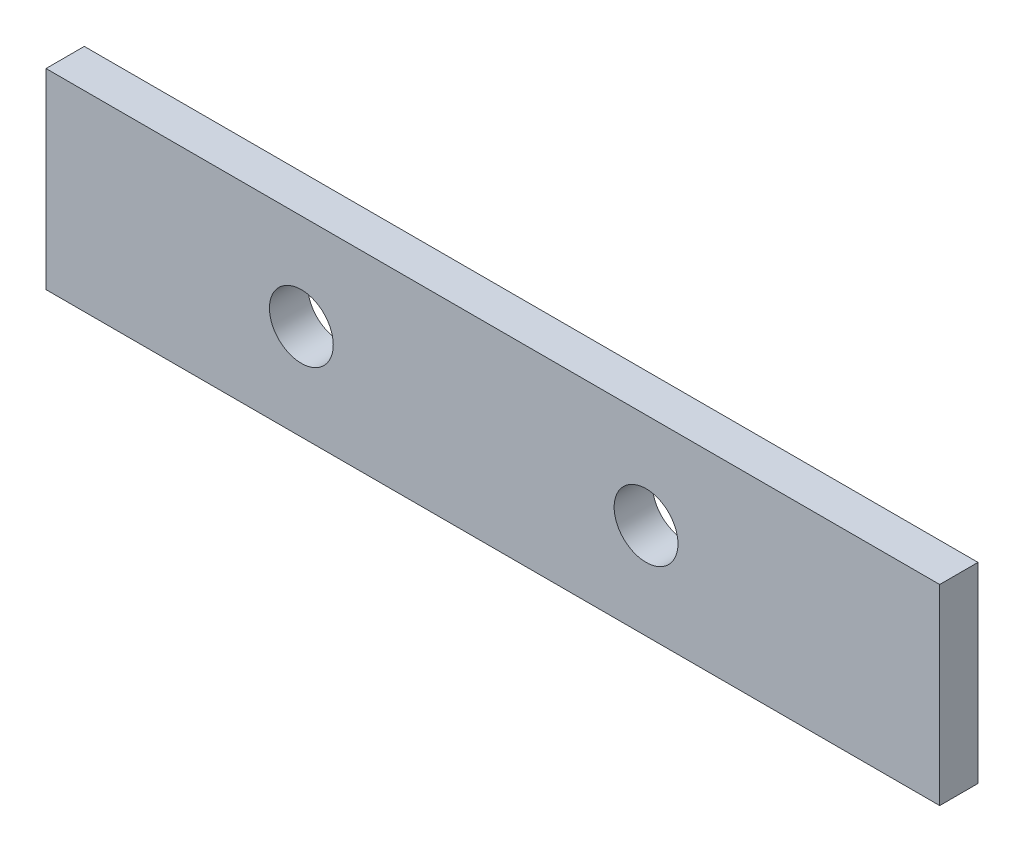
ISO-10303-21;
HEADER;
FILE_DESCRIPTION(('STEP AP214'),'2;1');
FILE_NAME('part.step','',(''),(''),'','','');
FILE_SCHEMA(('AUTOMOTIVE_DESIGN { 1 0 10303 214 1 1 1 1 }'));
ENDSEC;
DATA;
#1=APPLICATION_CONTEXT('core data for automotive mechanical design processes');
#2=APPLICATION_PROTOCOL_DEFINITION('international standard','automotive_design',2000,#1);
#3=PRODUCT_CONTEXT('',#1,'mechanical');
#4=PRODUCT('Part','Part','',(#3));
#5=PRODUCT_RELATED_PRODUCT_CATEGORY('part','',(#4));
#6=PRODUCT_DEFINITION_FORMATION('','',#4);
#7=PRODUCT_DEFINITION_CONTEXT('part definition',#1,'design');
#8=PRODUCT_DEFINITION('design','',#6,#7);
#9=PRODUCT_DEFINITION_SHAPE('','',#8);
#10=(LENGTH_UNIT() NAMED_UNIT(*) SI_UNIT(.MILLI.,.METRE.));
#11=(NAMED_UNIT(*) PLANE_ANGLE_UNIT() SI_UNIT($,.RADIAN.));
#12=(NAMED_UNIT(*) SI_UNIT($,.STERADIAN.) SOLID_ANGLE_UNIT());
#13=UNCERTAINTY_MEASURE_WITH_UNIT(LENGTH_MEASURE(1.E-05),#10,'distance_accuracy_value','');
#14=(GEOMETRIC_REPRESENTATION_CONTEXT(3) GLOBAL_UNCERTAINTY_ASSIGNED_CONTEXT((#13)) GLOBAL_UNIT_ASSIGNED_CONTEXT((#10,
#11,#12)) REPRESENTATION_CONTEXT('',''));
#15=CARTESIAN_POINT('',(0.,0.,0.));
#16=DIRECTION('',(0.,0.,1.));
#17=DIRECTION('',(1.,0.,0.));
#18=AXIS2_PLACEMENT_3D('',#15,#16,#17);
#19=CARTESIAN_POINT('',(350.,75.,-30.));
#20=DIRECTION('',(1.,0.,0.));
#21=DIRECTION('',(0.,0.,-1.));
#22=AXIS2_PLACEMENT_3D('',#19,#20,#21);
#23=PLANE('',#22);
#24=DIRECTION('',(0.,1.,0.));
#25=VECTOR('',#24,1.);
#26=CARTESIAN_POINT('',(350.,75.,0.));
#27=LINE('',#26,#25);
#28=CARTESIAN_POINT('',(350.,-75.,0.));
#29=VERTEX_POINT('',#28);
#30=CARTESIAN_POINT('',(350.,75.,0.));
#31=VERTEX_POINT('',#30);
#32=EDGE_CURVE('E110',#29,#31,#27,.T.);
#33=ORIENTED_EDGE('',*,*,#32,.F.);
#34=DIRECTION('',(0.,0.,1.));
#35=VECTOR('',#34,1.);
#36=CARTESIAN_POINT('',(350.,-75.,-30.));
#37=LINE('',#36,#35);
#38=CARTESIAN_POINT('',(350.,-75.,-30.));
#39=VERTEX_POINT('',#38);
#40=EDGE_CURVE('E11',#39,#29,#37,.T.);
#41=ORIENTED_EDGE('',*,*,#40,.F.);
#42=DIRECTION('',(0.,1.,0.));
#43=VECTOR('',#42,1.);
#44=CARTESIAN_POINT('',(350.,75.,-30.));
#45=LINE('',#44,#43);
#46=CARTESIAN_POINT('',(350.,75.,-30.));
#47=VERTEX_POINT('',#46);
#48=EDGE_CURVE('E101',#39,#47,#45,.T.);
#49=ORIENTED_EDGE('',*,*,#48,.T.);
#50=DIRECTION('',(0.,0.,1.));
#51=VECTOR('',#50,1.);
#52=CARTESIAN_POINT('',(350.,75.,-30.));
#53=LINE('',#52,#51);
#54=EDGE_CURVE('E42',#47,#31,#53,.T.);
#55=ORIENTED_EDGE('',*,*,#54,.T.);
#56=EDGE_LOOP('',(#33,#41,#49,#55));
#57=FACE_BOUND('',#56,.T.);
#58=ADVANCED_FACE('F39',(#57),#23,.T.);
#59=CARTESIAN_POINT('',(-350.,-75.,-30.));
#60=DIRECTION('',(0.,-1.,0.));
#61=DIRECTION('',(0.,0.,-1.));
#62=AXIS2_PLACEMENT_3D('',#59,#60,#61);
#63=PLANE('',#62);
#64=DIRECTION('',(1.,0.,0.));
#65=VECTOR('',#64,1.);
#66=CARTESIAN_POINT('',(-350.,-75.,0.));
#67=LINE('',#66,#65);
#68=CARTESIAN_POINT('',(-350.,-75.,0.));
#69=VERTEX_POINT('',#68);
#70=EDGE_CURVE('E104',#69,#29,#67,.T.);
#71=ORIENTED_EDGE('',*,*,#70,.F.);
#72=DIRECTION('',(0.,0.,1.));
#73=VECTOR('',#72,1.);
#74=CARTESIAN_POINT('',(-350.,-75.,-30.));
#75=LINE('',#74,#73);
#76=CARTESIAN_POINT('',(-350.,-75.,-30.));
#77=VERTEX_POINT('',#76);
#78=EDGE_CURVE('E49',#77,#69,#75,.T.);
#79=ORIENTED_EDGE('',*,*,#78,.F.);
#80=DIRECTION('',(1.,0.,0.));
#81=VECTOR('',#80,1.);
#82=CARTESIAN_POINT('',(-350.,-75.,-30.));
#83=LINE('',#82,#81);
#84=EDGE_CURVE('E96',#77,#39,#83,.T.);
#85=ORIENTED_EDGE('',*,*,#84,.T.);
#86=ORIENTED_EDGE('',*,*,#40,.T.);
#87=EDGE_LOOP('',(#71,#79,#85,#86));
#88=FACE_BOUND('',#87,.T.);
#89=ADVANCED_FACE('F127',(#88),#63,.T.);
#90=CARTESIAN_POINT('',(-350.,75.,-30.));
#91=DIRECTION('',(-1.,0.,0.));
#92=DIRECTION('',(0.,0.,1.));
#93=AXIS2_PLACEMENT_3D('',#90,#91,#92);
#94=PLANE('',#93);
#95=DIRECTION('',(0.,-1.,0.));
#96=VECTOR('',#95,1.);
#97=CARTESIAN_POINT('',(-350.,75.,0.));
#98=LINE('',#97,#96);
#99=CARTESIAN_POINT('',(-350.,75.,0.));
#100=VERTEX_POINT('',#99);
#101=EDGE_CURVE('E90',#100,#69,#98,.T.);
#102=ORIENTED_EDGE('',*,*,#101,.F.);
#103=DIRECTION('',(0.,0.,1.));
#104=VECTOR('',#103,1.);
#105=CARTESIAN_POINT('',(-350.,75.,-30.));
#106=LINE('',#105,#104);
#107=CARTESIAN_POINT('',(-350.,75.,-30.));
#108=VERTEX_POINT('',#107);
#109=EDGE_CURVE('E85',#108,#100,#106,.T.);
#110=ORIENTED_EDGE('',*,*,#109,.F.);
#111=DIRECTION('',(0.,-1.,0.));
#112=VECTOR('',#111,1.);
#113=CARTESIAN_POINT('',(-350.,75.,-30.));
#114=LINE('',#113,#112);
#115=EDGE_CURVE('E88',#108,#77,#114,.T.);
#116=ORIENTED_EDGE('',*,*,#115,.T.);
#117=ORIENTED_EDGE('',*,*,#78,.T.);
#118=EDGE_LOOP('',(#102,#110,#116,#117));
#119=FACE_BOUND('',#118,.T.);
#120=ADVANCED_FACE('F87',(#119),#94,.T.);
#121=CARTESIAN_POINT('',(-350.,75.,-30.));
#122=DIRECTION('',(0.,1.,0.));
#123=DIRECTION('',(0.,0.,1.));
#124=AXIS2_PLACEMENT_3D('',#121,#122,#123);
#125=PLANE('',#124);
#126=DIRECTION('',(-1.,0.,0.));
#127=VECTOR('',#126,1.);
#128=CARTESIAN_POINT('',(-350.,75.,0.));
#129=LINE('',#128,#127);
#130=EDGE_CURVE('E114',#31,#100,#129,.T.);
#131=ORIENTED_EDGE('',*,*,#130,.F.);
#132=ORIENTED_EDGE('',*,*,#54,.F.);
#133=DIRECTION('',(-1.,0.,0.));
#134=VECTOR('',#133,1.);
#135=CARTESIAN_POINT('',(-350.,75.,-30.));
#136=LINE('',#135,#134);
#137=EDGE_CURVE('E95',#47,#108,#136,.T.);
#138=ORIENTED_EDGE('',*,*,#137,.T.);
#139=ORIENTED_EDGE('',*,*,#109,.T.);
#140=EDGE_LOOP('',(#131,#132,#138,#139));
#141=FACE_BOUND('',#140,.T.);
#142=ADVANCED_FACE('F99',(#141),#125,.T.);
#143=CARTESIAN_POINT('',(0.,0.,-30.));
#144=DIRECTION('',(0.,0.,1.));
#145=DIRECTION('',(1.,0.,0.));
#146=AXIS2_PLACEMENT_3D('',#143,#144,#145);
#147=PLANE('',#146);
#148=CARTESIAN_POINT('',(120.,0.,-30.));
#149=DIRECTION('',(0.,0.,1.));
#150=DIRECTION('',(1.,0.,0.));
#151=AXIS2_PLACEMENT_3D('',#148,#149,#150);
#152=CIRCLE('',#151,25.);
#153=CARTESIAN_POINT('',(145.,0.,-30.));
#154=VERTEX_POINT('',#153);
#155=EDGE_CURVE('E160',#154,#154,#152,.T.);
#156=ORIENTED_EDGE('',*,*,#155,.T.);
#157=EDGE_LOOP('',(#156));
#158=FACE_BOUND('',#157,.T.);
#159=CARTESIAN_POINT('',(-150.,0.,-30.));
#160=DIRECTION('',(0.,0.,1.));
#161=DIRECTION('',(1.,0.,0.));
#162=AXIS2_PLACEMENT_3D('',#159,#160,#161);
#163=CIRCLE('',#162,25.);
#164=CARTESIAN_POINT('',(-125.,0.,-30.));
#165=VERTEX_POINT('',#164);
#166=EDGE_CURVE('E115',#165,#165,#163,.T.);
#167=ORIENTED_EDGE('',*,*,#166,.T.);
#168=EDGE_LOOP('',(#167));
#169=FACE_BOUND('',#168,.T.);
#170=ORIENTED_EDGE('',*,*,#48,.F.);
#171=ORIENTED_EDGE('',*,*,#84,.F.);
#172=ORIENTED_EDGE('',*,*,#115,.F.);
#173=ORIENTED_EDGE('',*,*,#137,.F.);
#174=EDGE_LOOP('',(#170,#171,#172,#173));
#175=FACE_BOUND('',#174,.T.);
#176=ADVANCED_FACE('F94',(#158,#169,#175),#147,.F.);
#177=CARTESIAN_POINT('',(0.,0.,0.));
#178=DIRECTION('',(0.,0.,1.));
#179=DIRECTION('',(1.,0.,0.));
#180=AXIS2_PLACEMENT_3D('',#177,#178,#179);
#181=PLANE('',#180);
#182=CARTESIAN_POINT('',(120.,0.,0.));
#183=DIRECTION('',(0.,0.,1.));
#184=DIRECTION('',(1.,0.,0.));
#185=AXIS2_PLACEMENT_3D('',#182,#183,#184);
#186=CIRCLE('',#185,25.);
#187=CARTESIAN_POINT('',(145.,0.,0.));
#188=VERTEX_POINT('',#187);
#189=EDGE_CURVE('E163',#188,#188,#186,.T.);
#190=ORIENTED_EDGE('',*,*,#189,.F.);
#191=EDGE_LOOP('',(#190));
#192=FACE_BOUND('',#191,.T.);
#193=CARTESIAN_POINT('',(-150.,0.,0.));
#194=DIRECTION('',(0.,0.,1.));
#195=DIRECTION('',(1.,0.,0.));
#196=AXIS2_PLACEMENT_3D('',#193,#194,#195);
#197=CIRCLE('',#196,25.);
#198=CARTESIAN_POINT('',(-125.,0.,0.));
#199=VERTEX_POINT('',#198);
#200=EDGE_CURVE('E167',#199,#199,#197,.T.);
#201=ORIENTED_EDGE('',*,*,#200,.F.);
#202=EDGE_LOOP('',(#201));
#203=FACE_BOUND('',#202,.T.);
#204=ORIENTED_EDGE('',*,*,#32,.T.);
#205=ORIENTED_EDGE('',*,*,#130,.T.);
#206=ORIENTED_EDGE('',*,*,#101,.T.);
#207=ORIENTED_EDGE('',*,*,#70,.T.);
#208=EDGE_LOOP('',(#204,#205,#206,#207));
#209=FACE_BOUND('',#208,.T.);
#210=ADVANCED_FACE('F126',(#192,#203,#209),#181,.T.);
#211=CARTESIAN_POINT('',(-150.,0.,-30.));
#212=DIRECTION('',(0.,0.,1.));
#213=DIRECTION('',(1.,0.,0.));
#214=AXIS2_PLACEMENT_3D('',#211,#212,#213);
#215=CYLINDRICAL_SURFACE('',#214,25.);
#216=ORIENTED_EDGE('',*,*,#166,.F.);
#217=EDGE_LOOP('',(#216));
#218=FACE_BOUND('',#217,.T.);
#219=ORIENTED_EDGE('',*,*,#200,.T.);
#220=EDGE_LOOP('',(#219));
#221=FACE_BOUND('',#220,.T.);
#222=ADVANCED_FACE('F145',(#218,#221),#215,.F.);
#223=CARTESIAN_POINT('',(120.,0.,-30.));
#224=DIRECTION('',(0.,0.,1.));
#225=DIRECTION('',(1.,0.,0.));
#226=AXIS2_PLACEMENT_3D('',#223,#224,#225);
#227=CYLINDRICAL_SURFACE('',#226,25.);
#228=ORIENTED_EDGE('',*,*,#155,.F.);
#229=EDGE_LOOP('',(#228));
#230=FACE_BOUND('',#229,.T.);
#231=ORIENTED_EDGE('',*,*,#189,.T.);
#232=EDGE_LOOP('',(#231));
#233=FACE_BOUND('',#232,.T.);
#234=ADVANCED_FACE('F152',(#230,#233),#227,.F.);
#235=CLOSED_SHELL('',(#58,#89,#120,#142,#176,#210,#222,#234));
#236=MANIFOLD_SOLID_BREP('B2',#235);
#237=ADVANCED_BREP_SHAPE_REPRESENTATION('',(#18,#236),#14);
#238=SHAPE_DEFINITION_REPRESENTATION(#9,#237);
ENDSEC;
END-ISO-10303-21;
